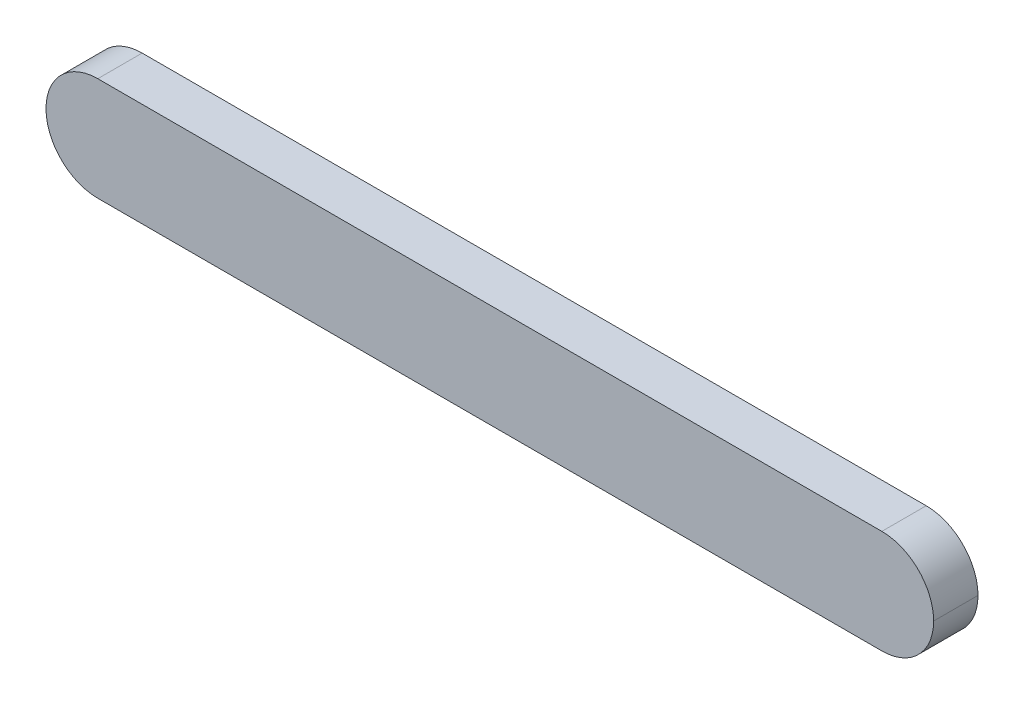
ISO-10303-21;
HEADER;
FILE_DESCRIPTION(('STEP AP214'),'2;1');
FILE_NAME('part.step','',(''),(''),'','','');
FILE_SCHEMA(('AUTOMOTIVE_DESIGN { 1 0 10303 214 1 1 1 1 }'));
ENDSEC;
DATA;
#1=APPLICATION_CONTEXT('core data for automotive mechanical design processes');
#2=APPLICATION_PROTOCOL_DEFINITION('international standard','automotive_design',2000,#1);
#3=PRODUCT_CONTEXT('',#1,'mechanical');
#4=PRODUCT('Part','Part','',(#3));
#5=PRODUCT_RELATED_PRODUCT_CATEGORY('part','',(#4));
#6=PRODUCT_DEFINITION_FORMATION('','',#4);
#7=PRODUCT_DEFINITION_CONTEXT('part definition',#1,'design');
#8=PRODUCT_DEFINITION('design','',#6,#7);
#9=PRODUCT_DEFINITION_SHAPE('','',#8);
#10=(LENGTH_UNIT() NAMED_UNIT(*) SI_UNIT(.MILLI.,.METRE.));
#11=(NAMED_UNIT(*) PLANE_ANGLE_UNIT() SI_UNIT($,.RADIAN.));
#12=(NAMED_UNIT(*) SI_UNIT($,.STERADIAN.) SOLID_ANGLE_UNIT());
#13=UNCERTAINTY_MEASURE_WITH_UNIT(LENGTH_MEASURE(1.E-05),#10,'distance_accuracy_value','');
#14=(GEOMETRIC_REPRESENTATION_CONTEXT(3) GLOBAL_UNCERTAINTY_ASSIGNED_CONTEXT((#13)) GLOBAL_UNIT_ASSIGNED_CONTEXT((#10,
#11,#12)) REPRESENTATION_CONTEXT('',''));
#15=CARTESIAN_POINT('',(0.,0.,0.));
#16=DIRECTION('',(0.,0.,1.));
#17=DIRECTION('',(1.,0.,0.));
#18=AXIS2_PLACEMENT_3D('',#15,#16,#17);
#19=CARTESIAN_POINT('',(-30.,3.5,3.));
#20=DIRECTION('',(0.,1.,0.));
#21=DIRECTION('',(0.,0.,1.));
#22=AXIS2_PLACEMENT_3D('',#19,#20,#21);
#23=PLANE('',#22);
#24=DIRECTION('',(1.,0.,0.));
#25=VECTOR('',#24,1.);
#26=CARTESIAN_POINT('',(-30.,3.5,0.));
#27=LINE('',#26,#25);
#28=CARTESIAN_POINT('',(-26.5,3.5,0.));
#29=VERTEX_POINT('',#28);
#30=CARTESIAN_POINT('',(26.5,3.5,0.));
#31=VERTEX_POINT('',#30);
#32=EDGE_CURVE('E114',#29,#31,#27,.T.);
#33=ORIENTED_EDGE('',*,*,#32,.F.);
#34=DIRECTION('',(0.,0.,-1.));
#35=VECTOR('',#34,1.);
#36=CARTESIAN_POINT('',(-26.5,3.5,3.));
#37=LINE('',#36,#35);
#38=CARTESIAN_POINT('',(-26.5,3.5,3.));
#39=VERTEX_POINT('',#38);
#40=EDGE_CURVE('E11',#29,#39,#37,.F.);
#41=ORIENTED_EDGE('',*,*,#40,.T.);
#42=DIRECTION('',(1.,0.,0.));
#43=VECTOR('',#42,1.);
#44=CARTESIAN_POINT('',(-30.,3.5,3.));
#45=LINE('',#44,#43);
#46=CARTESIAN_POINT('',(26.5,3.5,3.));
#47=VERTEX_POINT('',#46);
#48=EDGE_CURVE('E113',#39,#47,#45,.T.);
#49=ORIENTED_EDGE('',*,*,#48,.T.);
#50=DIRECTION('',(0.,0.,-1.));
#51=VECTOR('',#50,1.);
#52=CARTESIAN_POINT('',(26.5,3.5,0.));
#53=LINE('',#52,#51);
#54=EDGE_CURVE('E42',#47,#31,#53,.T.);
#55=ORIENTED_EDGE('',*,*,#54,.T.);
#56=EDGE_LOOP('',(#33,#41,#49,#55));
#57=FACE_BOUND('',#56,.T.);
#58=ADVANCED_FACE('F33',(#57),#23,.T.);
#59=CARTESIAN_POINT('',(-30.,-3.5,3.));
#60=DIRECTION('',(0.,1.,0.));
#61=DIRECTION('',(0.,0.,1.));
#62=AXIS2_PLACEMENT_3D('',#59,#60,#61);
#63=PLANE('',#62);
#64=DIRECTION('',(1.,0.,0.));
#65=VECTOR('',#64,1.);
#66=CARTESIAN_POINT('',(-30.,-3.5,3.));
#67=LINE('',#66,#65);
#68=CARTESIAN_POINT('',(-26.5,-3.5,3.));
#69=VERTEX_POINT('',#68);
#70=CARTESIAN_POINT('',(26.5,-3.5,3.));
#71=VERTEX_POINT('',#70);
#72=EDGE_CURVE('E106',#69,#71,#67,.T.);
#73=ORIENTED_EDGE('',*,*,#72,.F.);
#74=DIRECTION('',(0.,0.,-1.));
#75=VECTOR('',#74,1.);
#76=CARTESIAN_POINT('',(-26.5,-3.5,0.));
#77=LINE('',#76,#75);
#78=CARTESIAN_POINT('',(-26.5,-3.5,0.));
#79=VERTEX_POINT('',#78);
#80=EDGE_CURVE('E91',#69,#79,#77,.T.);
#81=ORIENTED_EDGE('',*,*,#80,.T.);
#82=DIRECTION('',(1.,0.,0.));
#83=VECTOR('',#82,1.);
#84=CARTESIAN_POINT('',(-30.,-3.5,0.));
#85=LINE('',#84,#83);
#86=CARTESIAN_POINT('',(26.5,-3.5,0.));
#87=VERTEX_POINT('',#86);
#88=EDGE_CURVE('E104',#79,#87,#85,.T.);
#89=ORIENTED_EDGE('',*,*,#88,.T.);
#90=DIRECTION('',(0.,0.,-1.));
#91=VECTOR('',#90,1.);
#92=CARTESIAN_POINT('',(26.5,-3.5,3.));
#93=LINE('',#92,#91);
#94=EDGE_CURVE('E108',#87,#71,#93,.F.);
#95=ORIENTED_EDGE('',*,*,#94,.T.);
#96=EDGE_LOOP('',(#73,#81,#89,#95));
#97=FACE_BOUND('',#96,.T.);
#98=ADVANCED_FACE('F102',(#97),#63,.F.);
#99=CARTESIAN_POINT('',(0.,0.,3.));
#100=DIRECTION('',(0.,0.,1.));
#101=DIRECTION('',(1.,0.,0.));
#102=AXIS2_PLACEMENT_3D('',#99,#100,#101);
#103=PLANE('',#102);
#104=CARTESIAN_POINT('',(-26.5,0.,3.));
#105=DIRECTION('',(0.,0.,1.));
#106=DIRECTION('',(1.,0.,0.));
#107=AXIS2_PLACEMENT_3D('',#104,#105,#106);
#108=CIRCLE('',#107,3.5);
#109=CARTESIAN_POINT('',(-30.,0.,3.));
#110=VERTEX_POINT('',#109);
#111=EDGE_CURVE('E57',#39,#110,#108,.T.);
#112=ORIENTED_EDGE('',*,*,#111,.T.);
#113=CARTESIAN_POINT('',(-26.5,0.,3.));
#114=DIRECTION('',(0.,0.,1.));
#115=DIRECTION('',(1.,0.,0.));
#116=AXIS2_PLACEMENT_3D('',#113,#114,#115);
#117=CIRCLE('',#116,3.5);
#118=EDGE_CURVE('E129',#110,#69,#117,.T.);
#119=ORIENTED_EDGE('',*,*,#118,.T.);
#120=ORIENTED_EDGE('',*,*,#72,.T.);
#121=CARTESIAN_POINT('',(26.5,0.,3.));
#122=DIRECTION('',(0.,0.,1.));
#123=DIRECTION('',(1.,0.,0.));
#124=AXIS2_PLACEMENT_3D('',#121,#122,#123);
#125=CIRCLE('',#124,3.5);
#126=CARTESIAN_POINT('',(30.,0.,3.));
#127=VERTEX_POINT('',#126);
#128=EDGE_CURVE('E50',#71,#127,#125,.T.);
#129=ORIENTED_EDGE('',*,*,#128,.T.);
#130=CARTESIAN_POINT('',(26.5,0.,3.));
#131=DIRECTION('',(0.,0.,1.));
#132=DIRECTION('',(1.,0.,0.));
#133=AXIS2_PLACEMENT_3D('',#130,#131,#132);
#134=CIRCLE('',#133,3.5);
#135=EDGE_CURVE('E96',#127,#47,#134,.T.);
#136=ORIENTED_EDGE('',*,*,#135,.T.);
#137=ORIENTED_EDGE('',*,*,#48,.F.);
#138=EDGE_LOOP('',(#112,#119,#120,#129,#136,#137));
#139=FACE_BOUND('',#138,.T.);
#140=ADVANCED_FACE('F138',(#139),#103,.T.);
#141=CARTESIAN_POINT('',(0.,0.,0.));
#142=DIRECTION('',(0.,0.,1.));
#143=DIRECTION('',(1.,0.,0.));
#144=AXIS2_PLACEMENT_3D('',#141,#142,#143);
#145=PLANE('',#144);
#146=ORIENTED_EDGE('',*,*,#88,.F.);
#147=CARTESIAN_POINT('',(-26.5,0.,0.));
#148=DIRECTION('',(0.,0.,1.));
#149=DIRECTION('',(1.,0.,0.));
#150=AXIS2_PLACEMENT_3D('',#147,#148,#149);
#151=CIRCLE('',#150,3.5);
#152=CARTESIAN_POINT('',(-30.,0.,0.));
#153=VERTEX_POINT('',#152);
#154=EDGE_CURVE('E87',#79,#153,#151,.F.);
#155=ORIENTED_EDGE('',*,*,#154,.T.);
#156=CARTESIAN_POINT('',(-26.5,0.,0.));
#157=DIRECTION('',(0.,0.,1.));
#158=DIRECTION('',(1.,0.,0.));
#159=AXIS2_PLACEMENT_3D('',#156,#157,#158);
#160=CIRCLE('',#159,3.5);
#161=EDGE_CURVE('E97',#153,#29,#160,.F.);
#162=ORIENTED_EDGE('',*,*,#161,.T.);
#163=ORIENTED_EDGE('',*,*,#32,.T.);
#164=CARTESIAN_POINT('',(26.5,0.,0.));
#165=DIRECTION('',(0.,0.,1.));
#166=DIRECTION('',(1.,0.,0.));
#167=AXIS2_PLACEMENT_3D('',#164,#165,#166);
#168=CIRCLE('',#167,3.5);
#169=CARTESIAN_POINT('',(30.,0.,0.));
#170=VERTEX_POINT('',#169);
#171=EDGE_CURVE('E107',#31,#170,#168,.F.);
#172=ORIENTED_EDGE('',*,*,#171,.T.);
#173=CARTESIAN_POINT('',(26.5,0.,0.));
#174=DIRECTION('',(0.,0.,1.));
#175=DIRECTION('',(1.,0.,0.));
#176=AXIS2_PLACEMENT_3D('',#173,#174,#175);
#177=CIRCLE('',#176,3.5);
#178=EDGE_CURVE('E112',#170,#87,#177,.F.);
#179=ORIENTED_EDGE('',*,*,#178,.T.);
#180=EDGE_LOOP('',(#146,#155,#162,#163,#172,#179));
#181=FACE_BOUND('',#180,.T.);
#182=ADVANCED_FACE('F110',(#181),#145,.F.);
#183=CARTESIAN_POINT('',(-26.5,0.,3.));
#184=DIRECTION('',(0.,0.,-1.));
#185=DIRECTION('',(-1.,0.,0.));
#186=AXIS2_PLACEMENT_3D('',#183,#184,#185);
#187=CYLINDRICAL_SURFACE('',#186,3.5);
#188=DIRECTION('',(0.,0.,-1.));
#189=VECTOR('',#188,1.);
#190=CARTESIAN_POINT('',(-30.,0.,3.));
#191=LINE('',#190,#189);
#192=EDGE_CURVE('E92',#110,#153,#191,.T.);
#193=ORIENTED_EDGE('',*,*,#192,.F.);
#194=ORIENTED_EDGE('',*,*,#111,.F.);
#195=ORIENTED_EDGE('',*,*,#40,.F.);
#196=ORIENTED_EDGE('',*,*,#161,.F.);
#197=EDGE_LOOP('',(#193,#194,#195,#196));
#198=FACE_BOUND('',#197,.T.);
#199=ADVANCED_FACE('F143',(#198),#187,.T.);
#200=CARTESIAN_POINT('',(-26.5,0.,3.));
#201=DIRECTION('',(0.,0.,1.));
#202=DIRECTION('',(1.,0.,0.));
#203=AXIS2_PLACEMENT_3D('',#200,#201,#202);
#204=CYLINDRICAL_SURFACE('',#203,3.5);
#205=ORIENTED_EDGE('',*,*,#118,.F.);
#206=ORIENTED_EDGE('',*,*,#192,.T.);
#207=ORIENTED_EDGE('',*,*,#154,.F.);
#208=ORIENTED_EDGE('',*,*,#80,.F.);
#209=EDGE_LOOP('',(#205,#206,#207,#208));
#210=FACE_BOUND('',#209,.T.);
#211=ADVANCED_FACE('F90',(#210),#204,.T.);
#212=CARTESIAN_POINT('',(26.5,0.,3.));
#213=DIRECTION('',(0.,0.,1.));
#214=DIRECTION('',(1.,0.,0.));
#215=AXIS2_PLACEMENT_3D('',#212,#213,#214);
#216=CYLINDRICAL_SURFACE('',#215,3.5);
#217=ORIENTED_EDGE('',*,*,#54,.F.);
#218=ORIENTED_EDGE('',*,*,#135,.F.);
#219=DIRECTION('',(0.,0.,-1.));
#220=VECTOR('',#219,1.);
#221=CARTESIAN_POINT('',(30.,0.,3.));
#222=LINE('',#221,#220);
#223=EDGE_CURVE('E37',#170,#127,#222,.F.);
#224=ORIENTED_EDGE('',*,*,#223,.F.);
#225=ORIENTED_EDGE('',*,*,#171,.F.);
#226=EDGE_LOOP('',(#217,#218,#224,#225));
#227=FACE_BOUND('',#226,.T.);
#228=ADVANCED_FACE('F35',(#227),#216,.T.);
#229=CARTESIAN_POINT('',(26.5,0.,3.));
#230=DIRECTION('',(0.,0.,-1.));
#231=DIRECTION('',(-1.,0.,0.));
#232=AXIS2_PLACEMENT_3D('',#229,#230,#231);
#233=CYLINDRICAL_SURFACE('',#232,3.5);
#234=ORIENTED_EDGE('',*,*,#128,.F.);
#235=ORIENTED_EDGE('',*,*,#94,.F.);
#236=ORIENTED_EDGE('',*,*,#178,.F.);
#237=ORIENTED_EDGE('',*,*,#223,.T.);
#238=EDGE_LOOP('',(#234,#235,#236,#237));
#239=FACE_BOUND('',#238,.T.);
#240=ADVANCED_FACE('F134',(#239),#233,.T.);
#241=CLOSED_SHELL('',(#58,#98,#140,#182,#199,#211,#228,#240));
#242=MANIFOLD_SOLID_BREP('B2',#241);
#243=ADVANCED_BREP_SHAPE_REPRESENTATION('',(#18,#242),#14);
#244=SHAPE_DEFINITION_REPRESENTATION(#9,#243);
ENDSEC;
END-ISO-10303-21;
